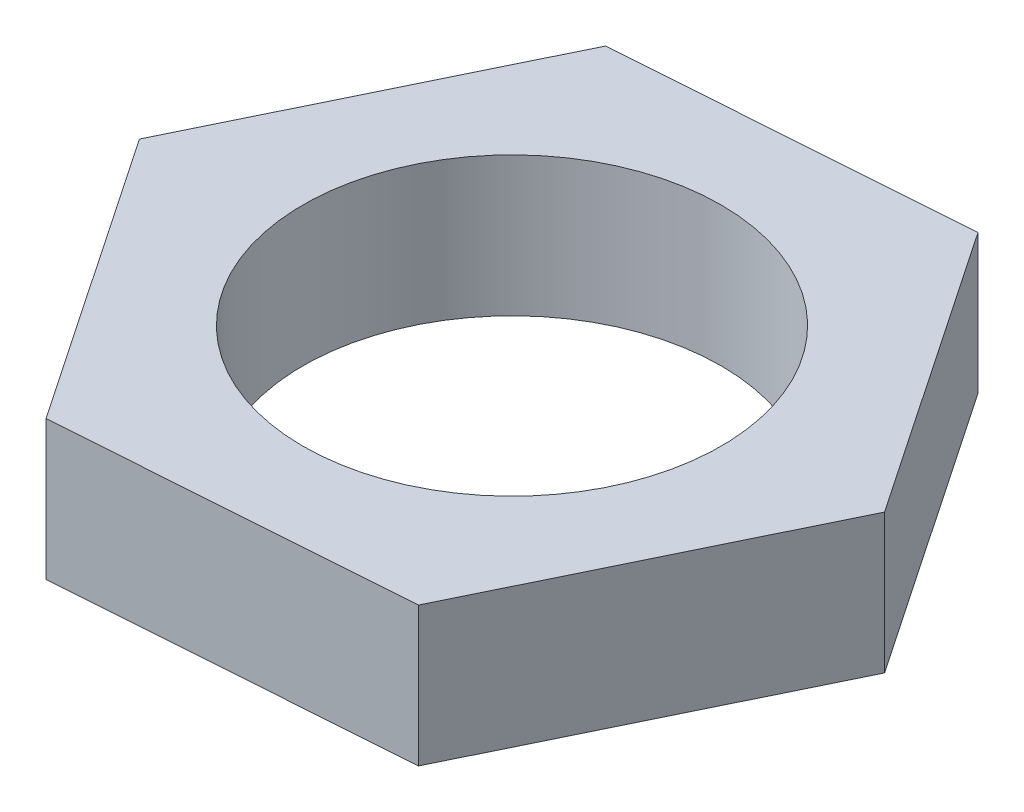
ISO-10303-21;
HEADER;
FILE_DESCRIPTION(('STEP AP214'),'2;1');
FILE_NAME('part.step','',(''),(''),'','','');
FILE_SCHEMA(('AUTOMOTIVE_DESIGN { 1 0 10303 214 1 1 1 1 }'));
ENDSEC;
DATA;
#1=APPLICATION_CONTEXT('core data for automotive mechanical design processes');
#2=APPLICATION_PROTOCOL_DEFINITION('international standard','automotive_design',2000,#1);
#3=PRODUCT_CONTEXT('',#1,'mechanical');
#4=PRODUCT('Part','Part','',(#3));
#5=PRODUCT_RELATED_PRODUCT_CATEGORY('part','',(#4));
#6=PRODUCT_DEFINITION_FORMATION('','',#4);
#7=PRODUCT_DEFINITION_CONTEXT('part definition',#1,'design');
#8=PRODUCT_DEFINITION('design','',#6,#7);
#9=PRODUCT_DEFINITION_SHAPE('','',#8);
#10=(LENGTH_UNIT() NAMED_UNIT(*) SI_UNIT(.MILLI.,.METRE.));
#11=(NAMED_UNIT(*) PLANE_ANGLE_UNIT() SI_UNIT($,.RADIAN.));
#12=(NAMED_UNIT(*) SI_UNIT($,.STERADIAN.) SOLID_ANGLE_UNIT());
#13=UNCERTAINTY_MEASURE_WITH_UNIT(LENGTH_MEASURE(1.E-05),#10,'distance_accuracy_value','');
#14=(GEOMETRIC_REPRESENTATION_CONTEXT(3) GLOBAL_UNCERTAINTY_ASSIGNED_CONTEXT((#13)) GLOBAL_UNIT_ASSIGNED_CONTEXT((#10,
#11,#12)) REPRESENTATION_CONTEXT('',''));
#15=CARTESIAN_POINT('',(0.,0.,0.));
#16=DIRECTION('',(0.,0.,1.));
#17=DIRECTION('',(1.,0.,0.));
#18=AXIS2_PLACEMENT_3D('',#15,#16,#17);
#19=CARTESIAN_POINT('',(0.,3.,0.));
#20=DIRECTION('',(0.,1.,0.));
#21=DIRECTION('',(0.,0.,1.));
#22=AXIS2_PLACEMENT_3D('',#19,#20,#21);
#23=PLANE('',#22);
#24=DIRECTION('',(0.99747334229898,0.,-0.0710417581630788));
#25=VECTOR('',#24,1.);
#26=CARTESIAN_POINT('',(-3.28152333939764,3.,6.7501805832379));
#27=LINE('',#26,#25);
#28=CARTESIAN_POINT('',(-3.28152333939764,3.,6.7501805832379));
#29=VERTEX_POINT('',#28);
#30=CARTESIAN_POINT('',(4.20506619551766,3.,6.21697286664885));
#31=VERTEX_POINT('',#30);
#32=EDGE_CURVE('E152',#29,#31,#27,.T.);
#33=ORIENTED_EDGE('',*,*,#32,.T.);
#34=DIRECTION('',(0.437212703850753,0.,-0.899358133110227));
#35=VECTOR('',#34,1.);
#36=CARTESIAN_POINT('',(4.20506619551766,3.,6.21697286664885));
#37=LINE('',#36,#35);
#38=CARTESIAN_POINT('',(7.4865895349153,3.,-0.533207716589054));
#39=VERTEX_POINT('',#38);
#40=EDGE_CURVE('E100',#31,#39,#37,.T.);
#41=ORIENTED_EDGE('',*,*,#40,.T.);
#42=DIRECTION('',(-0.560260638448227,0.,-0.828316374947148));
#43=VECTOR('',#42,1.);
#44=CARTESIAN_POINT('',(7.4865895349153,3.,-0.533207716589054));
#45=LINE('',#44,#43);
#46=CARTESIAN_POINT('',(3.28152333939764,3.,-6.7501805832379));
#47=VERTEX_POINT('',#46);
#48=EDGE_CURVE('E113',#39,#47,#45,.T.);
#49=ORIENTED_EDGE('',*,*,#48,.T.);
#50=DIRECTION('',(-0.99747334229898,0.,0.0710417581630788));
#51=VECTOR('',#50,1.);
#52=CARTESIAN_POINT('',(3.28152333939764,3.,-6.7501805832379));
#53=LINE('',#52,#51);
#54=CARTESIAN_POINT('',(-4.20506619551766,3.,-6.21697286664885));
#55=VERTEX_POINT('',#54);
#56=EDGE_CURVE('E107',#47,#55,#53,.T.);
#57=ORIENTED_EDGE('',*,*,#56,.T.);
#58=DIRECTION('',(-0.437212703850753,0.,0.899358133110227));
#59=VECTOR('',#58,1.);
#60=CARTESIAN_POINT('',(-4.20506619551766,3.,-6.21697286664885));
#61=LINE('',#60,#59);
#62=CARTESIAN_POINT('',(-7.4865895349153,3.,0.533207716589052));
#63=VERTEX_POINT('',#62);
#64=EDGE_CURVE('E111',#55,#63,#61,.T.);
#65=ORIENTED_EDGE('',*,*,#64,.T.);
#66=DIRECTION('',(0.560260638448227,0.,0.828316374947149));
#67=VECTOR('',#66,1.);
#68=CARTESIAN_POINT('',(-7.4865895349153,3.,0.533207716589052));
#69=LINE('',#68,#67);
#70=EDGE_CURVE('E63',#63,#29,#69,.T.);
#71=ORIENTED_EDGE('',*,*,#70,.T.);
#72=EDGE_LOOP('',(#33,#41,#49,#57,#65,#71));
#73=FACE_BOUND('',#72,.T.);
#74=CARTESIAN_POINT('',(0.,3.,0.));
#75=DIRECTION('',(0.,1.,0.));
#76=DIRECTION('',(0.,0.,1.));
#77=AXIS2_PLACEMENT_3D('',#74,#75,#76);
#78=CIRCLE('',#77,4.5);
#79=CARTESIAN_POINT('',(0.,3.,4.5));
#80=VERTEX_POINT('',#79);
#81=EDGE_CURVE('E140',#80,#80,#78,.T.);
#82=ORIENTED_EDGE('',*,*,#81,.F.);
#83=EDGE_LOOP('',(#82));
#84=FACE_BOUND('',#83,.T.);
#85=ADVANCED_FACE('F45',(#73,#84),#23,.T.);
#86=CARTESIAN_POINT('',(0.,0.,0.));
#87=DIRECTION('',(0.,1.,0.));
#88=DIRECTION('',(0.,0.,1.));
#89=AXIS2_PLACEMENT_3D('',#86,#87,#88);
#90=PLANE('',#89);
#91=DIRECTION('',(0.99747334229898,0.,-0.0710417581630788));
#92=VECTOR('',#91,1.);
#93=CARTESIAN_POINT('',(-3.28152333939764,0.,6.7501805832379));
#94=LINE('',#93,#92);
#95=CARTESIAN_POINT('',(-3.28152333939764,0.,6.7501805832379));
#96=VERTEX_POINT('',#95);
#97=CARTESIAN_POINT('',(4.20506619551766,0.,6.21697286664885));
#98=VERTEX_POINT('',#97);
#99=EDGE_CURVE('E135',#96,#98,#94,.T.);
#100=ORIENTED_EDGE('',*,*,#99,.F.);
#101=DIRECTION('',(0.560260638448227,0.,0.828316374947149));
#102=VECTOR('',#101,1.);
#103=CARTESIAN_POINT('',(-7.4865895349153,0.,0.533207716589052));
#104=LINE('',#103,#102);
#105=CARTESIAN_POINT('',(-7.4865895349153,0.,0.533207716589052));
#106=VERTEX_POINT('',#105);
#107=EDGE_CURVE('E92',#106,#96,#104,.T.);
#108=ORIENTED_EDGE('',*,*,#107,.F.);
#109=DIRECTION('',(-0.437212703850753,0.,0.899358133110227));
#110=VECTOR('',#109,1.);
#111=CARTESIAN_POINT('',(-4.20506619551766,0.,-6.21697286664885));
#112=LINE('',#111,#110);
#113=CARTESIAN_POINT('',(-4.20506619551766,0.,-6.21697286664885));
#114=VERTEX_POINT('',#113);
#115=EDGE_CURVE('E86',#114,#106,#112,.T.);
#116=ORIENTED_EDGE('',*,*,#115,.F.);
#117=DIRECTION('',(-0.99747334229898,0.,0.0710417581630788));
#118=VECTOR('',#117,1.);
#119=CARTESIAN_POINT('',(3.28152333939764,0.,-6.7501805832379));
#120=LINE('',#119,#118);
#121=CARTESIAN_POINT('',(3.28152333939764,0.,-6.7501805832379));
#122=VERTEX_POINT('',#121);
#123=EDGE_CURVE('E122',#122,#114,#120,.T.);
#124=ORIENTED_EDGE('',*,*,#123,.F.);
#125=DIRECTION('',(-0.560260638448227,0.,-0.828316374947148));
#126=VECTOR('',#125,1.);
#127=CARTESIAN_POINT('',(7.4865895349153,0.,-0.533207716589054));
#128=LINE('',#127,#126);
#129=CARTESIAN_POINT('',(7.4865895349153,0.,-0.533207716589054));
#130=VERTEX_POINT('',#129);
#131=EDGE_CURVE('E143',#130,#122,#128,.T.);
#132=ORIENTED_EDGE('',*,*,#131,.F.);
#133=DIRECTION('',(0.437212703850753,0.,-0.899358133110227));
#134=VECTOR('',#133,1.);
#135=CARTESIAN_POINT('',(4.20506619551766,0.,6.21697286664885));
#136=LINE('',#135,#134);
#137=EDGE_CURVE('E139',#98,#130,#136,.T.);
#138=ORIENTED_EDGE('',*,*,#137,.F.);
#139=EDGE_LOOP('',(#100,#108,#116,#124,#132,#138));
#140=FACE_BOUND('',#139,.T.);
#141=CARTESIAN_POINT('',(0.,0.,0.));
#142=DIRECTION('',(0.,1.,0.));
#143=DIRECTION('',(0.,0.,1.));
#144=AXIS2_PLACEMENT_3D('',#141,#142,#143);
#145=CIRCLE('',#144,4.5);
#146=CARTESIAN_POINT('',(0.,0.,4.5));
#147=VERTEX_POINT('',#146);
#148=EDGE_CURVE('E249',#147,#147,#145,.T.);
#149=ORIENTED_EDGE('',*,*,#148,.T.);
#150=EDGE_LOOP('',(#149));
#151=FACE_BOUND('',#150,.T.);
#152=ADVANCED_FACE('F165',(#140,#151),#90,.F.);
#153=CARTESIAN_POINT('',(-3.28152333939764,3.,6.7501805832379));
#154=DIRECTION('',(-0.0710417581630788,0.,-0.99747334229898));
#155=DIRECTION('',(-0.99747334229898,0.,0.0710417581630788));
#156=AXIS2_PLACEMENT_3D('',#153,#154,#155);
#157=PLANE('',#156);
#158=ORIENTED_EDGE('',*,*,#99,.T.);
#159=DIRECTION('',(0.,-1.,0.));
#160=VECTOR('',#159,1.);
#161=CARTESIAN_POINT('',(4.20506619551766,3.,6.21697286664885));
#162=LINE('',#161,#160);
#163=EDGE_CURVE('E11',#31,#98,#162,.T.);
#164=ORIENTED_EDGE('',*,*,#163,.F.);
#165=ORIENTED_EDGE('',*,*,#32,.F.);
#166=DIRECTION('',(0.,-1.,0.));
#167=VECTOR('',#166,1.);
#168=CARTESIAN_POINT('',(-3.28152333939764,3.,6.7501805832379));
#169=LINE('',#168,#167);
#170=EDGE_CURVE('E131',#29,#96,#169,.T.);
#171=ORIENTED_EDGE('',*,*,#170,.T.);
#172=EDGE_LOOP('',(#158,#164,#165,#171));
#173=FACE_BOUND('',#172,.T.);
#174=ADVANCED_FACE('F47',(#173),#157,.F.);
#175=CARTESIAN_POINT('',(4.20506619551766,3.,6.21697286664885));
#176=DIRECTION('',(-0.899358133110227,0.,-0.437212703850753));
#177=DIRECTION('',(-0.437212703850753,0.,0.899358133110227));
#178=AXIS2_PLACEMENT_3D('',#175,#176,#177);
#179=PLANE('',#178);
#180=ORIENTED_EDGE('',*,*,#137,.T.);
#181=DIRECTION('',(0.,-1.,0.));
#182=VECTOR('',#181,1.);
#183=CARTESIAN_POINT('',(7.4865895349153,3.,-0.533207716589054));
#184=LINE('',#183,#182);
#185=EDGE_CURVE('E55',#39,#130,#184,.T.);
#186=ORIENTED_EDGE('',*,*,#185,.F.);
#187=ORIENTED_EDGE('',*,*,#40,.F.);
#188=ORIENTED_EDGE('',*,*,#163,.T.);
#189=EDGE_LOOP('',(#180,#186,#187,#188));
#190=FACE_BOUND('',#189,.T.);
#191=ADVANCED_FACE('F190',(#190),#179,.F.);
#192=CARTESIAN_POINT('',(7.4865895349153,3.,-0.533207716589054));
#193=DIRECTION('',(-0.828316374947148,0.,0.560260638448227));
#194=DIRECTION('',(0.560260638448227,0.,0.828316374947148));
#195=AXIS2_PLACEMENT_3D('',#192,#193,#194);
#196=PLANE('',#195);
#197=ORIENTED_EDGE('',*,*,#131,.T.);
#198=DIRECTION('',(0.,-1.,0.));
#199=VECTOR('',#198,1.);
#200=CARTESIAN_POINT('',(3.28152333939764,3.,-6.7501805832379));
#201=LINE('',#200,#199);
#202=EDGE_CURVE('E124',#47,#122,#201,.T.);
#203=ORIENTED_EDGE('',*,*,#202,.F.);
#204=ORIENTED_EDGE('',*,*,#48,.F.);
#205=ORIENTED_EDGE('',*,*,#185,.T.);
#206=EDGE_LOOP('',(#197,#203,#204,#205));
#207=FACE_BOUND('',#206,.T.);
#208=ADVANCED_FACE('F162',(#207),#196,.F.);
#209=CARTESIAN_POINT('',(3.28152333939764,3.,-6.7501805832379));
#210=DIRECTION('',(0.0710417581630788,0.,0.99747334229898));
#211=DIRECTION('',(0.99747334229898,0.,-0.0710417581630788));
#212=AXIS2_PLACEMENT_3D('',#209,#210,#211);
#213=PLANE('',#212);
#214=ORIENTED_EDGE('',*,*,#123,.T.);
#215=DIRECTION('',(0.,-1.,0.));
#216=VECTOR('',#215,1.);
#217=CARTESIAN_POINT('',(-4.20506619551766,3.,-6.21697286664885));
#218=LINE('',#217,#216);
#219=EDGE_CURVE('E119',#55,#114,#218,.T.);
#220=ORIENTED_EDGE('',*,*,#219,.F.);
#221=ORIENTED_EDGE('',*,*,#56,.F.);
#222=ORIENTED_EDGE('',*,*,#202,.T.);
#223=EDGE_LOOP('',(#214,#220,#221,#222));
#224=FACE_BOUND('',#223,.T.);
#225=ADVANCED_FACE('F120',(#224),#213,.F.);
#226=CARTESIAN_POINT('',(-4.20506619551766,3.,-6.21697286664885));
#227=DIRECTION('',(0.899358133110227,0.,0.437212703850754));
#228=DIRECTION('',(0.437212703850754,0.,-0.899358133110227));
#229=AXIS2_PLACEMENT_3D('',#226,#227,#228);
#230=PLANE('',#229);
#231=ORIENTED_EDGE('',*,*,#115,.T.);
#232=DIRECTION('',(0.,-1.,0.));
#233=VECTOR('',#232,1.);
#234=CARTESIAN_POINT('',(-7.4865895349153,3.,0.533207716589052));
#235=LINE('',#234,#233);
#236=EDGE_CURVE('E125',#63,#106,#235,.T.);
#237=ORIENTED_EDGE('',*,*,#236,.F.);
#238=ORIENTED_EDGE('',*,*,#64,.F.);
#239=ORIENTED_EDGE('',*,*,#219,.T.);
#240=EDGE_LOOP('',(#231,#237,#238,#239));
#241=FACE_BOUND('',#240,.T.);
#242=ADVANCED_FACE('F127',(#241),#230,.F.);
#243=CARTESIAN_POINT('',(-7.4865895349153,3.,0.533207716589052));
#244=DIRECTION('',(0.828316374947149,0.,-0.560260638448227));
#245=DIRECTION('',(-0.560260638448227,0.,-0.828316374947149));
#246=AXIS2_PLACEMENT_3D('',#243,#244,#245);
#247=PLANE('',#246);
#248=ORIENTED_EDGE('',*,*,#107,.T.);
#249=ORIENTED_EDGE('',*,*,#170,.F.);
#250=ORIENTED_EDGE('',*,*,#70,.F.);
#251=ORIENTED_EDGE('',*,*,#236,.T.);
#252=EDGE_LOOP('',(#248,#249,#250,#251));
#253=FACE_BOUND('',#252,.T.);
#254=ADVANCED_FACE('F170',(#253),#247,.F.);
#255=CARTESIAN_POINT('',(0.,3.,0.));
#256=DIRECTION('',(0.,-1.,0.));
#257=DIRECTION('',(0.,0.,-1.));
#258=AXIS2_PLACEMENT_3D('',#255,#256,#257);
#259=CYLINDRICAL_SURFACE('',#258,4.5);
#260=ORIENTED_EDGE('',*,*,#81,.T.);
#261=EDGE_LOOP('',(#260));
#262=FACE_BOUND('',#261,.T.);
#263=ORIENTED_EDGE('',*,*,#148,.F.);
#264=EDGE_LOOP('',(#263));
#265=FACE_BOUND('',#264,.T.);
#266=ADVANCED_FACE('F172',(#262,#265),#259,.F.);
#267=CLOSED_SHELL('',(#85,#152,#174,#191,#208,#225,#242,#254,#266));
#268=MANIFOLD_SOLID_BREP('B2',#267);
#269=ADVANCED_BREP_SHAPE_REPRESENTATION('',(#18,#268),#14);
#270=SHAPE_DEFINITION_REPRESENTATION(#9,#269);
ENDSEC;
END-ISO-10303-21;
